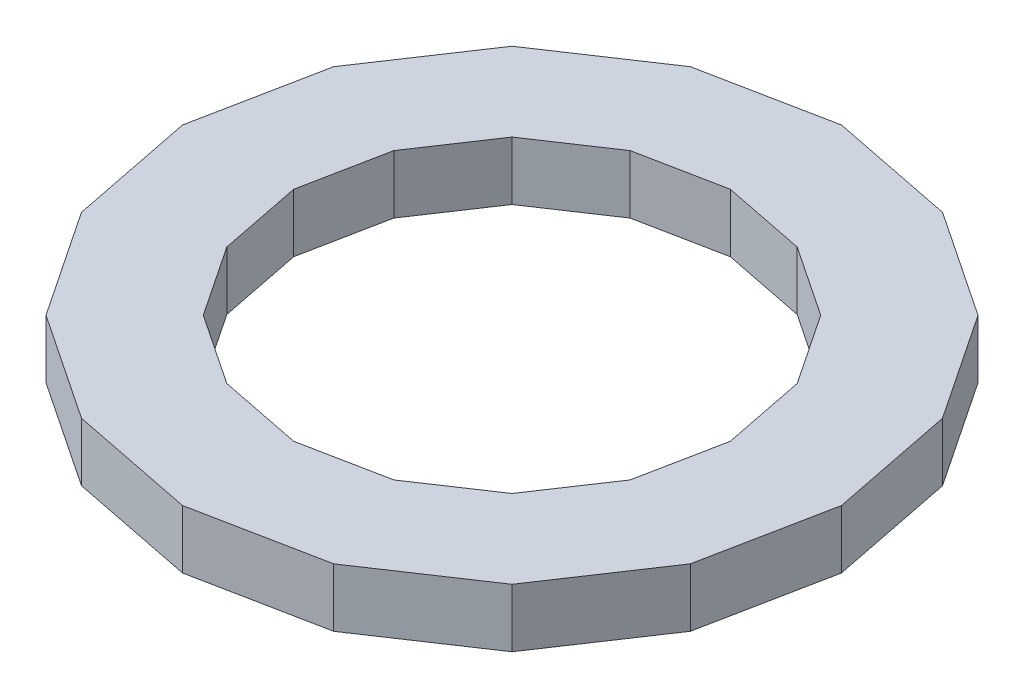
ISO-10303-21;
HEADER;
FILE_DESCRIPTION(('STEP AP214'),'2;1');
FILE_NAME('part.step','',(''),(''),'','','');
FILE_SCHEMA(('AUTOMOTIVE_DESIGN { 1 0 10303 214 1 1 1 1 }'));
ENDSEC;
DATA;
#1=APPLICATION_CONTEXT('core data for automotive mechanical design processes');
#2=APPLICATION_PROTOCOL_DEFINITION('international standard','automotive_design',2000,#1);
#3=PRODUCT_CONTEXT('',#1,'mechanical');
#4=PRODUCT('Part','Part','',(#3));
#5=PRODUCT_RELATED_PRODUCT_CATEGORY('part','',(#4));
#6=PRODUCT_DEFINITION_FORMATION('','',#4);
#7=PRODUCT_DEFINITION_CONTEXT('part definition',#1,'design');
#8=PRODUCT_DEFINITION('design','',#6,#7);
#9=PRODUCT_DEFINITION_SHAPE('','',#8);
#10=(LENGTH_UNIT() NAMED_UNIT(*) SI_UNIT(.MILLI.,.METRE.));
#11=(NAMED_UNIT(*) PLANE_ANGLE_UNIT() SI_UNIT($,.RADIAN.));
#12=(NAMED_UNIT(*) SI_UNIT($,.STERADIAN.) SOLID_ANGLE_UNIT());
#13=UNCERTAINTY_MEASURE_WITH_UNIT(LENGTH_MEASURE(1.E-05),#10,'distance_accuracy_value','');
#14=(GEOMETRIC_REPRESENTATION_CONTEXT(3) GLOBAL_UNCERTAINTY_ASSIGNED_CONTEXT((#13)) GLOBAL_UNIT_ASSIGNED_CONTEXT((#10,
#11,#12)) REPRESENTATION_CONTEXT('',''));
#15=CARTESIAN_POINT('',(0.,0.,0.));
#16=DIRECTION('',(0.,0.,1.));
#17=DIRECTION('',(1.,0.,0.));
#18=AXIS2_PLACEMENT_3D('',#15,#16,#17);
#19=CARTESIAN_POINT('',(0.,19.05,0.));
#20=DIRECTION('',(0.,1.,0.));
#21=DIRECTION('',(0.,0.,1.));
#22=AXIS2_PLACEMENT_3D('',#19,#20,#21);
#23=PLANE('',#22);
#24=DIRECTION('',(0.195090322016117,0.,-0.980785280403233));
#25=VECTOR('',#24,1.);
#26=CARTESIAN_POINT('',(99.2355510191511,19.05,41.1047111016983));
#27=LINE('',#26,#25);
#28=CARTESIAN_POINT('',(99.2355510191511,19.05,41.1047111016983));
#29=VERTEX_POINT('',#28);
#30=CARTESIAN_POINT('',(107.411786414847,19.05,-1.18654828935804E-12));
#31=VERTEX_POINT('',#30);
#32=EDGE_CURVE('E370',#29,#31,#27,.T.);
#33=ORIENTED_EDGE('',*,*,#32,.T.);
#34=DIRECTION('',(-0.195090322016139,0.,-0.980785280403228));
#35=VECTOR('',#34,1.);
#36=CARTESIAN_POINT('',(107.411786414847,19.05,-1.18654828935804E-12));
#37=LINE('',#36,#35);
#38=CARTESIAN_POINT('',(99.2355510191501,19.05,-41.1047111017005));
#39=VERTEX_POINT('',#38);
#40=EDGE_CURVE('E373',#31,#39,#37,.T.);
#41=ORIENTED_EDGE('',*,*,#40,.T.);
#42=DIRECTION('',(-0.555570233019612,0.,-0.831469612302539));
#43=VECTOR('',#42,1.);
#44=CARTESIAN_POINT('',(99.2355510191501,19.05,-41.1047111017005));
#45=LINE('',#44,#43);
#46=CARTESIAN_POINT('',(75.9516025532982,19.05,-75.9516025532999));
#47=VERTEX_POINT('',#46);
#48=EDGE_CURVE('E376',#39,#47,#45,.T.);
#49=ORIENTED_EDGE('',*,*,#48,.T.);
#50=DIRECTION('',(-0.831469612302551,0.,-0.555570233019593));
#51=VECTOR('',#50,1.);
#52=CARTESIAN_POINT('',(75.9516025532982,19.05,-75.9516025532999));
#53=LINE('',#52,#51);
#54=CARTESIAN_POINT('',(41.1047111016982,19.05,-99.2355510191511));
#55=VERTEX_POINT('',#54);
#56=EDGE_CURVE('E378',#47,#55,#53,.T.);
#57=ORIENTED_EDGE('',*,*,#56,.T.);
#58=DIRECTION('',(-0.980785280403233,0.,-0.195090322016117));
#59=VECTOR('',#58,1.);
#60=CARTESIAN_POINT('',(41.1047111016982,19.05,-99.2355510191511));
#61=LINE('',#60,#59);
#62=CARTESIAN_POINT('',(-1.20441912217675E-12,19.05,-107.411786414847));
#63=VERTEX_POINT('',#62);
#64=EDGE_CURVE('E380',#55,#63,#61,.T.);
#65=ORIENTED_EDGE('',*,*,#64,.T.);
#66=DIRECTION('',(-0.980785280403228,0.,0.195090322016139));
#67=VECTOR('',#66,1.);
#68=CARTESIAN_POINT('',(-1.20441912217675E-12,19.05,-107.411786414847));
#69=LINE('',#68,#67);
#70=CARTESIAN_POINT('',(-41.1047111017004,19.05,-99.2355510191502));
#71=VERTEX_POINT('',#70);
#72=EDGE_CURVE('E382',#63,#71,#69,.T.);
#73=ORIENTED_EDGE('',*,*,#72,.T.);
#74=DIRECTION('',(-0.831469612302539,0.,0.555570233019612));
#75=VECTOR('',#74,1.);
#76=CARTESIAN_POINT('',(-41.1047111017004,19.05,-99.2355510191502));
#77=LINE('',#76,#75);
#78=CARTESIAN_POINT('',(-75.9516025532999,19.05,-75.9516025532981));
#79=VERTEX_POINT('',#78);
#80=EDGE_CURVE('E384',#71,#79,#77,.T.);
#81=ORIENTED_EDGE('',*,*,#80,.T.);
#82=DIRECTION('',(-0.555570233019593,0.,0.831469612302552));
#83=VECTOR('',#82,1.);
#84=CARTESIAN_POINT('',(-75.9516025532999,19.05,-75.9516025532981));
#85=LINE('',#84,#83);
#86=CARTESIAN_POINT('',(-99.235551019151,19.05,-41.1047111016982));
#87=VERTEX_POINT('',#86);
#88=EDGE_CURVE('E386',#79,#87,#85,.T.);
#89=ORIENTED_EDGE('',*,*,#88,.T.);
#90=DIRECTION('',(-0.195090322016117,0.,0.980785280403233));
#91=VECTOR('',#90,1.);
#92=CARTESIAN_POINT('',(-99.235551019151,19.05,-41.1047111016982));
#93=LINE('',#92,#91);
#94=CARTESIAN_POINT('',(-107.411786414847,19.05,1.22649760240047E-12));
#95=VERTEX_POINT('',#94);
#96=EDGE_CURVE('E389',#87,#95,#93,.T.);
#97=ORIENTED_EDGE('',*,*,#96,.T.);
#98=DIRECTION('',(0.195090322016139,0.,0.980785280403228));
#99=VECTOR('',#98,1.);
#100=CARTESIAN_POINT('',(-107.411786414847,19.05,1.22649760240047E-12));
#101=LINE('',#100,#99);
#102=CARTESIAN_POINT('',(-99.2355510191501,19.05,41.1047111017005));
#103=VERTEX_POINT('',#102);
#104=EDGE_CURVE('E391',#95,#103,#101,.T.);
#105=ORIENTED_EDGE('',*,*,#104,.T.);
#106=DIRECTION('',(0.555570233019612,0.,0.831469612302539));
#107=VECTOR('',#106,1.);
#108=CARTESIAN_POINT('',(-99.2355510191501,19.05,41.1047111017005));
#109=LINE('',#108,#107);
#110=CARTESIAN_POINT('',(-75.9516025532982,19.05,75.9516025532999));
#111=VERTEX_POINT('',#110);
#112=EDGE_CURVE('E393',#103,#111,#109,.T.);
#113=ORIENTED_EDGE('',*,*,#112,.T.);
#114=DIRECTION('',(0.831469612302551,0.,0.555570233019593));
#115=VECTOR('',#114,1.);
#116=CARTESIAN_POINT('',(-75.9516025532982,19.05,75.9516025532999));
#117=LINE('',#116,#115);
#118=CARTESIAN_POINT('',(-41.1047111016983,19.05,99.235551019151));
#119=VERTEX_POINT('',#118);
#120=EDGE_CURVE('E396',#111,#119,#117,.T.);
#121=ORIENTED_EDGE('',*,*,#120,.T.);
#122=DIRECTION('',(0.980785280403233,0.,0.195090322016117));
#123=VECTOR('',#122,1.);
#124=CARTESIAN_POINT('',(-41.1047111016983,19.05,99.235551019151));
#125=LINE('',#124,#123);
#126=CARTESIAN_POINT('',(1.21963172159676E-12,19.05,107.411786414847));
#127=VERTEX_POINT('',#126);
#128=EDGE_CURVE('E399',#119,#127,#125,.T.);
#129=ORIENTED_EDGE('',*,*,#128,.T.);
#130=DIRECTION('',(0.980785280403228,0.,-0.195090322016139));
#131=VECTOR('',#130,1.);
#132=CARTESIAN_POINT('',(1.21963172159676E-12,19.05,107.411786414847));
#133=LINE('',#132,#131);
#134=CARTESIAN_POINT('',(41.1047111017005,19.05,99.2355510191502));
#135=VERTEX_POINT('',#134);
#136=EDGE_CURVE('E401',#127,#135,#133,.T.);
#137=ORIENTED_EDGE('',*,*,#136,.T.);
#138=DIRECTION('',(0.831469612302539,0.,-0.555570233019612));
#139=VECTOR('',#138,1.);
#140=CARTESIAN_POINT('',(41.1047111017005,19.05,99.2355510191502));
#141=LINE('',#140,#139);
#142=CARTESIAN_POINT('',(75.9516025532999,19.05,75.9516025532982));
#143=VERTEX_POINT('',#142);
#144=EDGE_CURVE('E404',#135,#143,#141,.T.);
#145=ORIENTED_EDGE('',*,*,#144,.T.);
#146=DIRECTION('',(0.555570233019593,0.,-0.831469612302552));
#147=VECTOR('',#146,1.);
#148=CARTESIAN_POINT('',(75.9516025532999,19.05,75.9516025532982));
#149=LINE('',#148,#147);
#150=EDGE_CURVE('E407',#143,#29,#149,.T.);
#151=ORIENTED_EDGE('',*,*,#150,.T.);
#152=EDGE_LOOP('',(#33,#41,#49,#57,#65,#73,#81,#89,#97,#105,#113,#121,#129,#137,#145,#151));
#153=FACE_BOUND('',#152,.T.);
#154=DIRECTION('',(-0.195090322016139,0.,-0.980785280403228));
#155=VECTOR('',#154,1.);
#156=CARTESIAN_POINT('',(71.1551248289587,19.05,-8.46654608505615E-13));
#157=LINE('',#156,#155);
#158=CARTESIAN_POINT('',(71.1551248289587,19.05,-8.46654608505615E-13));
#159=VERTEX_POINT('',#158);
#160=CARTESIAN_POINT('',(65.7387634627603,19.05,-27.2298873999131));
#161=VERTEX_POINT('',#160);
#162=EDGE_CURVE('E252',#159,#161,#157,.T.);
#163=ORIENTED_EDGE('',*,*,#162,.F.);
#164=DIRECTION('',(0.195090322016117,0.,-0.980785280403233));
#165=VECTOR('',#164,1.);
#166=CARTESIAN_POINT('',(65.7387634627609,19.05,27.2298873999116));
#167=LINE('',#166,#165);
#168=CARTESIAN_POINT('',(65.7387634627609,19.05,27.2298873999116));
#169=VERTEX_POINT('',#168);
#170=EDGE_CURVE('E243',#169,#159,#167,.T.);
#171=ORIENTED_EDGE('',*,*,#170,.F.);
#172=DIRECTION('',(0.555570233019593,0.,-0.831469612302552));
#173=VECTOR('',#172,1.);
#174=CARTESIAN_POINT('',(50.3142712827325,19.05,50.3142712827314));
#175=LINE('',#174,#173);
#176=CARTESIAN_POINT('',(50.3142712827325,19.05,50.3142712827314));
#177=VERTEX_POINT('',#176);
#178=EDGE_CURVE('E295',#177,#169,#175,.T.);
#179=ORIENTED_EDGE('',*,*,#178,.F.);
#180=DIRECTION('',(0.831469612302539,0.,-0.555570233019612));
#181=VECTOR('',#180,1.);
#182=CARTESIAN_POINT('',(27.2298873999131,19.05,65.7387634627603));
#183=LINE('',#182,#181);
#184=CARTESIAN_POINT('',(27.2298873999131,19.05,65.7387634627603));
#185=VERTEX_POINT('',#184);
#186=EDGE_CURVE('E293',#185,#177,#183,.T.);
#187=ORIENTED_EDGE('',*,*,#186,.F.);
#188=DIRECTION('',(0.980785280403228,0.,-0.19509032201614));
#189=VECTOR('',#188,1.);
#190=CARTESIAN_POINT('',(8.62105711361428E-13,19.05,71.1551248289587));
#191=LINE('',#190,#189);
#192=CARTESIAN_POINT('',(8.62105711361428E-13,19.05,71.1551248289587));
#193=VERTEX_POINT('',#192);
#194=EDGE_CURVE('E291',#193,#185,#191,.T.);
#195=ORIENTED_EDGE('',*,*,#194,.F.);
#196=DIRECTION('',(0.980785280403233,0.,0.195090322016117));
#197=VECTOR('',#196,1.);
#198=CARTESIAN_POINT('',(-27.2298873999116,19.05,65.7387634627609));
#199=LINE('',#198,#197);
#200=CARTESIAN_POINT('',(-27.2298873999116,19.05,65.7387634627609));
#201=VERTEX_POINT('',#200);
#202=EDGE_CURVE('E289',#201,#193,#199,.T.);
#203=ORIENTED_EDGE('',*,*,#202,.F.);
#204=DIRECTION('',(0.831469612302552,0.,0.555570233019593));
#205=VECTOR('',#204,1.);
#206=CARTESIAN_POINT('',(-50.3142712827314,19.05,50.3142712827326));
#207=LINE('',#206,#205);
#208=CARTESIAN_POINT('',(-50.3142712827314,19.05,50.3142712827326));
#209=VERTEX_POINT('',#208);
#210=EDGE_CURVE('E287',#209,#201,#207,.T.);
#211=ORIENTED_EDGE('',*,*,#210,.F.);
#212=DIRECTION('',(0.555570233019612,0.,0.831469612302539));
#213=VECTOR('',#212,1.);
#214=CARTESIAN_POINT('',(-65.7387634627603,19.05,27.2298873999131));
#215=LINE('',#214,#213);
#216=CARTESIAN_POINT('',(-65.7387634627603,19.05,27.2298873999131));
#217=VERTEX_POINT('',#216);
#218=EDGE_CURVE('E285',#217,#209,#215,.T.);
#219=ORIENTED_EDGE('',*,*,#218,.F.);
#220=DIRECTION('',(0.195090322016139,0.,0.980785280403228));
#221=VECTOR('',#220,1.);
#222=CARTESIAN_POINT('',(-71.1551248289587,19.05,8.25619489808786E-13));
#223=LINE('',#222,#221);
#224=CARTESIAN_POINT('',(-71.1551248289587,19.05,8.25619489808786E-13));
#225=VERTEX_POINT('',#224);
#226=EDGE_CURVE('E283',#225,#217,#223,.T.);
#227=ORIENTED_EDGE('',*,*,#226,.F.);
#228=DIRECTION('',(-0.195090322016117,0.,0.980785280403233));
#229=VECTOR('',#228,1.);
#230=CARTESIAN_POINT('',(-65.7387634627609,19.05,-27.2298873999116));
#231=LINE('',#230,#229);
#232=CARTESIAN_POINT('',(-65.7387634627609,19.05,-27.2298873999116));
#233=VERTEX_POINT('',#232);
#234=EDGE_CURVE('E280',#233,#225,#231,.T.);
#235=ORIENTED_EDGE('',*,*,#234,.F.);
#236=DIRECTION('',(-0.555570233019593,0.,0.831469612302551));
#237=VECTOR('',#236,1.);
#238=CARTESIAN_POINT('',(-50.3142712827325,19.05,-50.3142712827314));
#239=LINE('',#238,#237);
#240=CARTESIAN_POINT('',(-50.3142712827325,19.05,-50.3142712827314));
#241=VERTEX_POINT('',#240);
#242=EDGE_CURVE('E277',#241,#233,#239,.T.);
#243=ORIENTED_EDGE('',*,*,#242,.F.);
#244=DIRECTION('',(-0.831469612302539,0.,0.555570233019612));
#245=VECTOR('',#244,1.);
#246=CARTESIAN_POINT('',(-27.2298873999131,19.05,-65.7387634627603));
#247=LINE('',#246,#245);
#248=CARTESIAN_POINT('',(-27.2298873999131,19.05,-65.7387634627603));
#249=VERTEX_POINT('',#248);
#250=EDGE_CURVE('E275',#249,#241,#247,.T.);
#251=ORIENTED_EDGE('',*,*,#250,.F.);
#252=DIRECTION('',(-0.980785280403228,0.,0.19509032201614));
#253=VECTOR('',#252,1.);
#254=CARTESIAN_POINT('',(-8.39524885614129E-13,19.05,-71.1551248289587));
#255=LINE('',#254,#253);
#256=CARTESIAN_POINT('',(-8.39524885614129E-13,19.05,-71.1551248289587));
#257=VERTEX_POINT('',#256);
#258=EDGE_CURVE('E273',#257,#249,#255,.T.);
#259=ORIENTED_EDGE('',*,*,#258,.F.);
#260=DIRECTION('',(-0.980785280403233,0.,-0.195090322016117));
#261=VECTOR('',#260,1.);
#262=CARTESIAN_POINT('',(27.2298873999116,19.05,-65.7387634627609));
#263=LINE('',#262,#261);
#264=CARTESIAN_POINT('',(27.2298873999116,19.05,-65.7387634627609));
#265=VERTEX_POINT('',#264);
#266=EDGE_CURVE('E271',#265,#257,#263,.T.);
#267=ORIENTED_EDGE('',*,*,#266,.F.);
#268=DIRECTION('',(-0.831469612302551,0.,-0.555570233019593));
#269=VECTOR('',#268,1.);
#270=CARTESIAN_POINT('',(50.3142712827314,19.05,-50.3142712827326));
#271=LINE('',#270,#269);
#272=CARTESIAN_POINT('',(50.3142712827314,19.05,-50.3142712827326));
#273=VERTEX_POINT('',#272);
#274=EDGE_CURVE('E267',#273,#265,#271,.T.);
#275=ORIENTED_EDGE('',*,*,#274,.F.);
#276=DIRECTION('',(-0.555570233019612,0.,-0.831469612302539));
#277=VECTOR('',#276,1.);
#278=CARTESIAN_POINT('',(65.7387634627603,19.05,-27.2298873999131));
#279=LINE('',#278,#277);
#280=EDGE_CURVE('E265',#161,#273,#279,.T.);
#281=ORIENTED_EDGE('',*,*,#280,.F.);
#282=EDGE_LOOP('',(#163,#171,#179,#187,#195,#203,#211,#219,#227,#235,#243,#251,#259,#267,#275,#281));
#283=FACE_BOUND('',#282,.T.);
#284=ADVANCED_FACE('F34',(#153,#283),#23,.T.);
#285=CARTESIAN_POINT('',(0.,0.,0.));
#286=DIRECTION('',(0.,1.,0.));
#287=DIRECTION('',(0.,0.,1.));
#288=AXIS2_PLACEMENT_3D('',#285,#286,#287);
#289=PLANE('',#288);
#290=DIRECTION('',(0.195090322016117,0.,-0.980785280403233));
#291=VECTOR('',#290,1.);
#292=CARTESIAN_POINT('',(99.2355510191511,0.,41.1047111016983));
#293=LINE('',#292,#291);
#294=CARTESIAN_POINT('',(99.2355510191511,0.,41.1047111016983));
#295=VERTEX_POINT('',#294);
#296=CARTESIAN_POINT('',(107.411786414847,0.,-1.18654828935804E-12));
#297=VERTEX_POINT('',#296);
#298=EDGE_CURVE('E260',#295,#297,#293,.T.);
#299=ORIENTED_EDGE('',*,*,#298,.F.);
#300=DIRECTION('',(0.555570233019593,0.,-0.831469612302552));
#301=VECTOR('',#300,1.);
#302=CARTESIAN_POINT('',(75.9516025532999,0.,75.9516025532982));
#303=LINE('',#302,#301);
#304=CARTESIAN_POINT('',(75.9516025532999,0.,75.9516025532982));
#305=VERTEX_POINT('',#304);
#306=EDGE_CURVE('E374',#305,#295,#303,.T.);
#307=ORIENTED_EDGE('',*,*,#306,.F.);
#308=DIRECTION('',(0.831469612302539,0.,-0.555570233019612));
#309=VECTOR('',#308,1.);
#310=CARTESIAN_POINT('',(41.1047111017005,0.,99.2355510191502));
#311=LINE('',#310,#309);
#312=CARTESIAN_POINT('',(41.1047111017005,0.,99.2355510191502));
#313=VERTEX_POINT('',#312);
#314=EDGE_CURVE('E442',#313,#305,#311,.T.);
#315=ORIENTED_EDGE('',*,*,#314,.F.);
#316=DIRECTION('',(0.980785280403228,0.,-0.195090322016139));
#317=VECTOR('',#316,1.);
#318=CARTESIAN_POINT('',(1.21963172159676E-12,0.,107.411786414847));
#319=LINE('',#318,#317);
#320=CARTESIAN_POINT('',(1.21963172159676E-12,0.,107.411786414847));
#321=VERTEX_POINT('',#320);
#322=EDGE_CURVE('E439',#321,#313,#319,.T.);
#323=ORIENTED_EDGE('',*,*,#322,.F.);
#324=DIRECTION('',(0.980785280403233,0.,0.195090322016117));
#325=VECTOR('',#324,1.);
#326=CARTESIAN_POINT('',(-41.1047111016983,0.,99.235551019151));
#327=LINE('',#326,#325);
#328=CARTESIAN_POINT('',(-41.1047111016983,0.,99.235551019151));
#329=VERTEX_POINT('',#328);
#330=EDGE_CURVE('E436',#329,#321,#327,.T.);
#331=ORIENTED_EDGE('',*,*,#330,.F.);
#332=DIRECTION('',(0.831469612302551,0.,0.555570233019593));
#333=VECTOR('',#332,1.);
#334=CARTESIAN_POINT('',(-75.9516025532982,0.,75.9516025532999));
#335=LINE('',#334,#333);
#336=CARTESIAN_POINT('',(-75.9516025532982,0.,75.9516025532999));
#337=VERTEX_POINT('',#336);
#338=EDGE_CURVE('E433',#337,#329,#335,.T.);
#339=ORIENTED_EDGE('',*,*,#338,.F.);
#340=DIRECTION('',(0.555570233019612,0.,0.831469612302539));
#341=VECTOR('',#340,1.);
#342=CARTESIAN_POINT('',(-99.2355510191501,0.,41.1047111017005));
#343=LINE('',#342,#341);
#344=CARTESIAN_POINT('',(-99.2355510191501,0.,41.1047111017005));
#345=VERTEX_POINT('',#344);
#346=EDGE_CURVE('E431',#345,#337,#343,.T.);
#347=ORIENTED_EDGE('',*,*,#346,.F.);
#348=DIRECTION('',(0.195090322016139,0.,0.980785280403228));
#349=VECTOR('',#348,1.);
#350=CARTESIAN_POINT('',(-107.411786414847,0.,1.22649760240047E-12));
#351=LINE('',#350,#349);
#352=CARTESIAN_POINT('',(-107.411786414847,0.,1.22649760240047E-12));
#353=VERTEX_POINT('',#352);
#354=EDGE_CURVE('E428',#353,#345,#351,.T.);
#355=ORIENTED_EDGE('',*,*,#354,.F.);
#356=DIRECTION('',(-0.195090322016117,0.,0.980785280403233));
#357=VECTOR('',#356,1.);
#358=CARTESIAN_POINT('',(-99.235551019151,0.,-41.1047111016982));
#359=LINE('',#358,#357);
#360=CARTESIAN_POINT('',(-99.235551019151,0.,-41.1047111016982));
#361=VERTEX_POINT('',#360);
#362=EDGE_CURVE('E426',#361,#353,#359,.T.);
#363=ORIENTED_EDGE('',*,*,#362,.F.);
#364=DIRECTION('',(-0.555570233019593,0.,0.831469612302552));
#365=VECTOR('',#364,1.);
#366=CARTESIAN_POINT('',(-75.9516025532999,0.,-75.9516025532981));
#367=LINE('',#366,#365);
#368=CARTESIAN_POINT('',(-75.9516025532999,0.,-75.9516025532981));
#369=VERTEX_POINT('',#368);
#370=EDGE_CURVE('E424',#369,#361,#367,.T.);
#371=ORIENTED_EDGE('',*,*,#370,.F.);
#372=DIRECTION('',(-0.831469612302539,0.,0.555570233019612));
#373=VECTOR('',#372,1.);
#374=CARTESIAN_POINT('',(-41.1047111017004,0.,-99.2355510191502));
#375=LINE('',#374,#373);
#376=CARTESIAN_POINT('',(-41.1047111017004,0.,-99.2355510191502));
#377=VERTEX_POINT('',#376);
#378=EDGE_CURVE('E422',#377,#369,#375,.T.);
#379=ORIENTED_EDGE('',*,*,#378,.F.);
#380=DIRECTION('',(-0.980785280403228,0.,0.195090322016139));
#381=VECTOR('',#380,1.);
#382=CARTESIAN_POINT('',(-1.20441912217675E-12,0.,-107.411786414847));
#383=LINE('',#382,#381);
#384=CARTESIAN_POINT('',(-1.20441912217675E-12,0.,-107.411786414847));
#385=VERTEX_POINT('',#384);
#386=EDGE_CURVE('E420',#385,#377,#383,.T.);
#387=ORIENTED_EDGE('',*,*,#386,.F.);
#388=DIRECTION('',(-0.980785280403233,0.,-0.195090322016117));
#389=VECTOR('',#388,1.);
#390=CARTESIAN_POINT('',(41.1047111016982,0.,-99.2355510191511));
#391=LINE('',#390,#389);
#392=CARTESIAN_POINT('',(41.1047111016982,0.,-99.2355510191511));
#393=VERTEX_POINT('',#392);
#394=EDGE_CURVE('E418',#393,#385,#391,.T.);
#395=ORIENTED_EDGE('',*,*,#394,.F.);
#396=DIRECTION('',(-0.831469612302551,0.,-0.555570233019593));
#397=VECTOR('',#396,1.);
#398=CARTESIAN_POINT('',(75.9516025532982,0.,-75.9516025532999));
#399=LINE('',#398,#397);
#400=CARTESIAN_POINT('',(75.9516025532982,0.,-75.9516025532999));
#401=VERTEX_POINT('',#400);
#402=EDGE_CURVE('E416',#401,#393,#399,.T.);
#403=ORIENTED_EDGE('',*,*,#402,.F.);
#404=DIRECTION('',(-0.555570233019612,0.,-0.831469612302539));
#405=VECTOR('',#404,1.);
#406=CARTESIAN_POINT('',(99.2355510191501,0.,-41.1047111017005));
#407=LINE('',#406,#405);
#408=CARTESIAN_POINT('',(99.2355510191501,0.,-41.1047111017005));
#409=VERTEX_POINT('',#408);
#410=EDGE_CURVE('E414',#409,#401,#407,.T.);
#411=ORIENTED_EDGE('',*,*,#410,.F.);
#412=DIRECTION('',(-0.195090322016139,0.,-0.980785280403228));
#413=VECTOR('',#412,1.);
#414=CARTESIAN_POINT('',(107.411786414847,0.,-1.18654828935804E-12));
#415=LINE('',#414,#413);
#416=EDGE_CURVE('E412',#297,#409,#415,.T.);
#417=ORIENTED_EDGE('',*,*,#416,.F.);
#418=EDGE_LOOP('',(#299,#307,#315,#323,#331,#339,#347,#355,#363,#371,#379,#387,#395,#403,#411,#417));
#419=FACE_BOUND('',#418,.T.);
#420=DIRECTION('',(0.195090322016117,0.,-0.980785280403233));
#421=VECTOR('',#420,1.);
#422=CARTESIAN_POINT('',(65.7387634627609,0.,27.2298873999116));
#423=LINE('',#422,#421);
#424=CARTESIAN_POINT('',(65.7387634627609,0.,27.2298873999116));
#425=VERTEX_POINT('',#424);
#426=CARTESIAN_POINT('',(71.1551248289587,0.,-8.46654608505615E-13));
#427=VERTEX_POINT('',#426);
#428=EDGE_CURVE('E57',#425,#427,#423,.T.);
#429=ORIENTED_EDGE('',*,*,#428,.T.);
#430=DIRECTION('',(-0.195090322016139,0.,-0.980785280403228));
#431=VECTOR('',#430,1.);
#432=CARTESIAN_POINT('',(71.1551248289587,0.,-8.46654608505615E-13));
#433=LINE('',#432,#431);
#434=CARTESIAN_POINT('',(65.7387634627603,0.,-27.2298873999131));
#435=VERTEX_POINT('',#434);
#436=EDGE_CURVE('E259',#427,#435,#433,.T.);
#437=ORIENTED_EDGE('',*,*,#436,.T.);
#438=DIRECTION('',(-0.555570233019612,0.,-0.831469612302539));
#439=VECTOR('',#438,1.);
#440=CARTESIAN_POINT('',(65.7387634627603,0.,-27.2298873999131));
#441=LINE('',#440,#439);
#442=CARTESIAN_POINT('',(50.3142712827314,0.,-50.3142712827326));
#443=VERTEX_POINT('',#442);
#444=EDGE_CURVE('E299',#435,#443,#441,.T.);
#445=ORIENTED_EDGE('',*,*,#444,.T.);
#446=DIRECTION('',(-0.831469612302551,0.,-0.555570233019593));
#447=VECTOR('',#446,1.);
#448=CARTESIAN_POINT('',(50.3142712827314,0.,-50.3142712827326));
#449=LINE('',#448,#447);
#450=CARTESIAN_POINT('',(27.2298873999116,0.,-65.7387634627609));
#451=VERTEX_POINT('',#450);
#452=EDGE_CURVE('E302',#443,#451,#449,.T.);
#453=ORIENTED_EDGE('',*,*,#452,.T.);
#454=DIRECTION('',(-0.980785280403233,0.,-0.195090322016117));
#455=VECTOR('',#454,1.);
#456=CARTESIAN_POINT('',(27.2298873999116,0.,-65.7387634627609));
#457=LINE('',#456,#455);
#458=CARTESIAN_POINT('',(-8.39524885614129E-13,0.,-71.1551248289587));
#459=VERTEX_POINT('',#458);
#460=EDGE_CURVE('E305',#451,#459,#457,.T.);
#461=ORIENTED_EDGE('',*,*,#460,.T.);
#462=DIRECTION('',(-0.980785280403228,0.,0.19509032201614));
#463=VECTOR('',#462,1.);
#464=CARTESIAN_POINT('',(-8.39524885614129E-13,0.,-71.1551248289587));
#465=LINE('',#464,#463);
#466=CARTESIAN_POINT('',(-27.2298873999131,0.,-65.7387634627603));
#467=VERTEX_POINT('',#466);
#468=EDGE_CURVE('E308',#459,#467,#465,.T.);
#469=ORIENTED_EDGE('',*,*,#468,.T.);
#470=DIRECTION('',(-0.831469612302539,0.,0.555570233019612));
#471=VECTOR('',#470,1.);
#472=CARTESIAN_POINT('',(-27.2298873999131,0.,-65.7387634627603));
#473=LINE('',#472,#471);
#474=CARTESIAN_POINT('',(-50.3142712827325,0.,-50.3142712827314));
#475=VERTEX_POINT('',#474);
#476=EDGE_CURVE('E311',#467,#475,#473,.T.);
#477=ORIENTED_EDGE('',*,*,#476,.T.);
#478=DIRECTION('',(-0.555570233019593,0.,0.831469612302551));
#479=VECTOR('',#478,1.);
#480=CARTESIAN_POINT('',(-50.3142712827325,0.,-50.3142712827314));
#481=LINE('',#480,#479);
#482=CARTESIAN_POINT('',(-65.7387634627609,0.,-27.2298873999116));
#483=VERTEX_POINT('',#482);
#484=EDGE_CURVE('E314',#475,#483,#481,.T.);
#485=ORIENTED_EDGE('',*,*,#484,.T.);
#486=DIRECTION('',(-0.195090322016117,0.,0.980785280403233));
#487=VECTOR('',#486,1.);
#488=CARTESIAN_POINT('',(-65.7387634627609,0.,-27.2298873999116));
#489=LINE('',#488,#487);
#490=CARTESIAN_POINT('',(-71.1551248289587,0.,8.25619489808786E-13));
#491=VERTEX_POINT('',#490);
#492=EDGE_CURVE('E317',#483,#491,#489,.T.);
#493=ORIENTED_EDGE('',*,*,#492,.T.);
#494=DIRECTION('',(0.195090322016139,0.,0.980785280403228));
#495=VECTOR('',#494,1.);
#496=CARTESIAN_POINT('',(-71.1551248289587,0.,8.25619489808786E-13));
#497=LINE('',#496,#495);
#498=CARTESIAN_POINT('',(-65.7387634627603,0.,27.2298873999131));
#499=VERTEX_POINT('',#498);
#500=EDGE_CURVE('E321',#491,#499,#497,.T.);
#501=ORIENTED_EDGE('',*,*,#500,.T.);
#502=DIRECTION('',(0.555570233019612,0.,0.831469612302539));
#503=VECTOR('',#502,1.);
#504=CARTESIAN_POINT('',(-65.7387634627603,0.,27.2298873999131));
#505=LINE('',#504,#503);
#506=CARTESIAN_POINT('',(-50.3142712827314,0.,50.3142712827326));
#507=VERTEX_POINT('',#506);
#508=EDGE_CURVE('E324',#499,#507,#505,.T.);
#509=ORIENTED_EDGE('',*,*,#508,.T.);
#510=DIRECTION('',(0.831469612302552,0.,0.555570233019593));
#511=VECTOR('',#510,1.);
#512=CARTESIAN_POINT('',(-50.3142712827314,0.,50.3142712827326));
#513=LINE('',#512,#511);
#514=CARTESIAN_POINT('',(-27.2298873999116,0.,65.7387634627609));
#515=VERTEX_POINT('',#514);
#516=EDGE_CURVE('E327',#507,#515,#513,.T.);
#517=ORIENTED_EDGE('',*,*,#516,.T.);
#518=DIRECTION('',(0.980785280403233,0.,0.195090322016117));
#519=VECTOR('',#518,1.);
#520=CARTESIAN_POINT('',(-27.2298873999116,0.,65.7387634627609));
#521=LINE('',#520,#519);
#522=CARTESIAN_POINT('',(8.62105711361428E-13,0.,71.1551248289587));
#523=VERTEX_POINT('',#522);
#524=EDGE_CURVE('E330',#515,#523,#521,.T.);
#525=ORIENTED_EDGE('',*,*,#524,.T.);
#526=DIRECTION('',(0.980785280403228,0.,-0.19509032201614));
#527=VECTOR('',#526,1.);
#528=CARTESIAN_POINT('',(8.62105711361428E-13,0.,71.1551248289587));
#529=LINE('',#528,#527);
#530=CARTESIAN_POINT('',(27.2298873999131,0.,65.7387634627603));
#531=VERTEX_POINT('',#530);
#532=EDGE_CURVE('E333',#523,#531,#529,.T.);
#533=ORIENTED_EDGE('',*,*,#532,.T.);
#534=DIRECTION('',(0.831469612302539,0.,-0.555570233019612));
#535=VECTOR('',#534,1.);
#536=CARTESIAN_POINT('',(27.2298873999131,0.,65.7387634627603));
#537=LINE('',#536,#535);
#538=CARTESIAN_POINT('',(50.3142712827325,0.,50.3142712827314));
#539=VERTEX_POINT('',#538);
#540=EDGE_CURVE('E336',#531,#539,#537,.T.);
#541=ORIENTED_EDGE('',*,*,#540,.T.);
#542=DIRECTION('',(0.555570233019593,0.,-0.831469612302552));
#543=VECTOR('',#542,1.);
#544=CARTESIAN_POINT('',(50.3142712827325,0.,50.3142712827314));
#545=LINE('',#544,#543);
#546=EDGE_CURVE('E253',#539,#425,#545,.T.);
#547=ORIENTED_EDGE('',*,*,#546,.T.);
#548=EDGE_LOOP('',(#429,#437,#445,#453,#461,#469,#477,#485,#493,#501,#509,#517,#525,#533,#541,#547));
#549=FACE_BOUND('',#548,.T.);
#550=ADVANCED_FACE('F500',(#419,#549),#289,.F.);
#551=CARTESIAN_POINT('',(99.2355510191511,19.05,41.1047111016983));
#552=DIRECTION('',(-0.980785280403233,0.,-0.195090322016117));
#553=DIRECTION('',(-0.195090322016117,0.,0.980785280403233));
#554=AXIS2_PLACEMENT_3D('',#551,#552,#553);
#555=PLANE('',#554);
#556=ORIENTED_EDGE('',*,*,#298,.T.);
#557=DIRECTION('',(0.,-1.,0.));
#558=VECTOR('',#557,1.);
#559=CARTESIAN_POINT('',(107.411786414847,19.05,-1.18654828935804E-12));
#560=LINE('',#559,#558);
#561=EDGE_CURVE('E11',#31,#297,#560,.T.);
#562=ORIENTED_EDGE('',*,*,#561,.F.);
#563=ORIENTED_EDGE('',*,*,#32,.F.);
#564=DIRECTION('',(0.,-1.,0.));
#565=VECTOR('',#564,1.);
#566=CARTESIAN_POINT('',(99.2355510191511,19.05,41.1047111016983));
#567=LINE('',#566,#565);
#568=EDGE_CURVE('E409',#29,#295,#567,.T.);
#569=ORIENTED_EDGE('',*,*,#568,.T.);
#570=EDGE_LOOP('',(#556,#562,#563,#569));
#571=FACE_BOUND('',#570,.T.);
#572=ADVANCED_FACE('F36',(#571),#555,.F.);
#573=CARTESIAN_POINT('',(107.411786414847,19.05,-1.18654828935804E-12));
#574=DIRECTION('',(-0.980785280403228,0.,0.195090322016139));
#575=DIRECTION('',(0.195090322016139,0.,0.980785280403228));
#576=AXIS2_PLACEMENT_3D('',#573,#574,#575);
#577=PLANE('',#576);
#578=ORIENTED_EDGE('',*,*,#416,.T.);
#579=DIRECTION('',(0.,-1.,0.));
#580=VECTOR('',#579,1.);
#581=CARTESIAN_POINT('',(99.2355510191501,19.05,-41.1047111017005));
#582=LINE('',#581,#580);
#583=EDGE_CURVE('E42',#39,#409,#582,.T.);
#584=ORIENTED_EDGE('',*,*,#583,.F.);
#585=ORIENTED_EDGE('',*,*,#40,.F.);
#586=ORIENTED_EDGE('',*,*,#561,.T.);
#587=EDGE_LOOP('',(#578,#584,#585,#586));
#588=FACE_BOUND('',#587,.T.);
#589=ADVANCED_FACE('F517',(#588),#577,.F.);
#590=CARTESIAN_POINT('',(99.2355510191501,19.05,-41.1047111017005));
#591=DIRECTION('',(-0.831469612302539,0.,0.555570233019612));
#592=DIRECTION('',(0.555570233019612,0.,0.831469612302539));
#593=AXIS2_PLACEMENT_3D('',#590,#591,#592);
#594=PLANE('',#593);
#595=ORIENTED_EDGE('',*,*,#410,.T.);
#596=DIRECTION('',(0.,-1.,0.));
#597=VECTOR('',#596,1.);
#598=CARTESIAN_POINT('',(75.9516025532982,19.05,-75.9516025532999));
#599=LINE('',#598,#597);
#600=EDGE_CURVE('E487',#47,#401,#599,.T.);
#601=ORIENTED_EDGE('',*,*,#600,.F.);
#602=ORIENTED_EDGE('',*,*,#48,.F.);
#603=ORIENTED_EDGE('',*,*,#583,.T.);
#604=EDGE_LOOP('',(#595,#601,#602,#603));
#605=FACE_BOUND('',#604,.T.);
#606=ADVANCED_FACE('F494',(#605),#594,.F.);
#607=CARTESIAN_POINT('',(75.9516025532982,19.05,-75.9516025532999));
#608=DIRECTION('',(-0.555570233019593,0.,0.831469612302551));
#609=DIRECTION('',(0.831469612302551,0.,0.555570233019593));
#610=AXIS2_PLACEMENT_3D('',#607,#608,#609);
#611=PLANE('',#610);
#612=ORIENTED_EDGE('',*,*,#402,.T.);
#613=DIRECTION('',(0.,-1.,0.));
#614=VECTOR('',#613,1.);
#615=CARTESIAN_POINT('',(41.1047111016982,19.05,-99.2355510191511));
#616=LINE('',#615,#614);
#617=EDGE_CURVE('E483',#55,#393,#616,.T.);
#618=ORIENTED_EDGE('',*,*,#617,.F.);
#619=ORIENTED_EDGE('',*,*,#56,.F.);
#620=ORIENTED_EDGE('',*,*,#600,.T.);
#621=EDGE_LOOP('',(#612,#618,#619,#620));
#622=FACE_BOUND('',#621,.T.);
#623=ADVANCED_FACE('F506',(#622),#611,.F.);
#624=CARTESIAN_POINT('',(41.1047111016982,19.05,-99.2355510191511));
#625=DIRECTION('',(-0.195090322016117,0.,0.980785280403233));
#626=DIRECTION('',(0.980785280403233,0.,0.195090322016117));
#627=AXIS2_PLACEMENT_3D('',#624,#625,#626);
#628=PLANE('',#627);
#629=ORIENTED_EDGE('',*,*,#394,.T.);
#630=DIRECTION('',(0.,-1.,0.));
#631=VECTOR('',#630,1.);
#632=CARTESIAN_POINT('',(-1.20441912217675E-12,19.05,-107.411786414847));
#633=LINE('',#632,#631);
#634=EDGE_CURVE('E480',#63,#385,#633,.T.);
#635=ORIENTED_EDGE('',*,*,#634,.F.);
#636=ORIENTED_EDGE('',*,*,#64,.F.);
#637=ORIENTED_EDGE('',*,*,#617,.T.);
#638=EDGE_LOOP('',(#629,#635,#636,#637));
#639=FACE_BOUND('',#638,.T.);
#640=ADVANCED_FACE('F510',(#639),#628,.F.);
#641=CARTESIAN_POINT('',(-1.20441912217675E-12,19.05,-107.411786414847));
#642=DIRECTION('',(0.195090322016139,0.,0.980785280403228));
#643=DIRECTION('',(0.980785280403228,0.,-0.195090322016139));
#644=AXIS2_PLACEMENT_3D('',#641,#642,#643);
#645=PLANE('',#644);
#646=ORIENTED_EDGE('',*,*,#386,.T.);
#647=DIRECTION('',(0.,-1.,0.));
#648=VECTOR('',#647,1.);
#649=CARTESIAN_POINT('',(-41.1047111017004,19.05,-99.2355510191502));
#650=LINE('',#649,#648);
#651=EDGE_CURVE('E476',#71,#377,#650,.T.);
#652=ORIENTED_EDGE('',*,*,#651,.F.);
#653=ORIENTED_EDGE('',*,*,#72,.F.);
#654=ORIENTED_EDGE('',*,*,#634,.T.);
#655=EDGE_LOOP('',(#646,#652,#653,#654));
#656=FACE_BOUND('',#655,.T.);
#657=ADVANCED_FACE('F570',(#656),#645,.F.);
#658=CARTESIAN_POINT('',(-41.1047111017004,19.05,-99.2355510191502));
#659=DIRECTION('',(0.555570233019612,0.,0.831469612302539));
#660=DIRECTION('',(0.831469612302539,0.,-0.555570233019612));
#661=AXIS2_PLACEMENT_3D('',#658,#659,#660);
#662=PLANE('',#661);
#663=ORIENTED_EDGE('',*,*,#378,.T.);
#664=DIRECTION('',(0.,-1.,0.));
#665=VECTOR('',#664,1.);
#666=CARTESIAN_POINT('',(-75.9516025532999,19.05,-75.9516025532981));
#667=LINE('',#666,#665);
#668=EDGE_CURVE('E473',#79,#369,#667,.T.);
#669=ORIENTED_EDGE('',*,*,#668,.F.);
#670=ORIENTED_EDGE('',*,*,#80,.F.);
#671=ORIENTED_EDGE('',*,*,#651,.T.);
#672=EDGE_LOOP('',(#663,#669,#670,#671));
#673=FACE_BOUND('',#672,.T.);
#674=ADVANCED_FACE('F567',(#673),#662,.F.);
#675=CARTESIAN_POINT('',(-75.9516025532999,19.05,-75.9516025532981));
#676=DIRECTION('',(0.831469612302552,0.,0.555570233019593));
#677=DIRECTION('',(0.555570233019593,0.,-0.831469612302552));
#678=AXIS2_PLACEMENT_3D('',#675,#676,#677);
#679=PLANE('',#678);
#680=ORIENTED_EDGE('',*,*,#370,.T.);
#681=DIRECTION('',(0.,-1.,0.));
#682=VECTOR('',#681,1.);
#683=CARTESIAN_POINT('',(-99.235551019151,19.05,-41.1047111016982));
#684=LINE('',#683,#682);
#685=EDGE_CURVE('E470',#87,#361,#684,.T.);
#686=ORIENTED_EDGE('',*,*,#685,.F.);
#687=ORIENTED_EDGE('',*,*,#88,.F.);
#688=ORIENTED_EDGE('',*,*,#668,.T.);
#689=EDGE_LOOP('',(#680,#686,#687,#688));
#690=FACE_BOUND('',#689,.T.);
#691=ADVANCED_FACE('F563',(#690),#679,.F.);
#692=CARTESIAN_POINT('',(-99.235551019151,19.05,-41.1047111016982));
#693=DIRECTION('',(0.980785280403233,0.,0.195090322016117));
#694=DIRECTION('',(0.195090322016117,0.,-0.980785280403233));
#695=AXIS2_PLACEMENT_3D('',#692,#693,#694);
#696=PLANE('',#695);
#697=ORIENTED_EDGE('',*,*,#362,.T.);
#698=DIRECTION('',(0.,-1.,0.));
#699=VECTOR('',#698,1.);
#700=CARTESIAN_POINT('',(-107.411786414847,19.05,1.22649760240047E-12));
#701=LINE('',#700,#699);
#702=EDGE_CURVE('E467',#95,#353,#701,.T.);
#703=ORIENTED_EDGE('',*,*,#702,.F.);
#704=ORIENTED_EDGE('',*,*,#96,.F.);
#705=ORIENTED_EDGE('',*,*,#685,.T.);
#706=EDGE_LOOP('',(#697,#703,#704,#705));
#707=FACE_BOUND('',#706,.T.);
#708=ADVANCED_FACE('F559',(#707),#696,.F.);
#709=CARTESIAN_POINT('',(-107.411786414847,19.05,1.22649760240047E-12));
#710=DIRECTION('',(0.980785280403228,0.,-0.195090322016139));
#711=DIRECTION('',(-0.195090322016139,0.,-0.980785280403228));
#712=AXIS2_PLACEMENT_3D('',#709,#710,#711);
#713=PLANE('',#712);
#714=ORIENTED_EDGE('',*,*,#354,.T.);
#715=DIRECTION('',(0.,-1.,0.));
#716=VECTOR('',#715,1.);
#717=CARTESIAN_POINT('',(-99.2355510191501,19.05,41.1047111017005));
#718=LINE('',#717,#716);
#719=EDGE_CURVE('E463',#103,#345,#718,.T.);
#720=ORIENTED_EDGE('',*,*,#719,.F.);
#721=ORIENTED_EDGE('',*,*,#104,.F.);
#722=ORIENTED_EDGE('',*,*,#702,.T.);
#723=EDGE_LOOP('',(#714,#720,#721,#722));
#724=FACE_BOUND('',#723,.T.);
#725=ADVANCED_FACE('F554',(#724),#713,.F.);
#726=CARTESIAN_POINT('',(-99.2355510191501,19.05,41.1047111017005));
#727=DIRECTION('',(0.831469612302539,0.,-0.555570233019612));
#728=DIRECTION('',(-0.555570233019612,0.,-0.831469612302539));
#729=AXIS2_PLACEMENT_3D('',#726,#727,#728);
#730=PLANE('',#729);
#731=ORIENTED_EDGE('',*,*,#346,.T.);
#732=DIRECTION('',(0.,-1.,0.));
#733=VECTOR('',#732,1.);
#734=CARTESIAN_POINT('',(-75.9516025532982,19.05,75.9516025532999));
#735=LINE('',#734,#733);
#736=EDGE_CURVE('E460',#111,#337,#735,.T.);
#737=ORIENTED_EDGE('',*,*,#736,.F.);
#738=ORIENTED_EDGE('',*,*,#112,.F.);
#739=ORIENTED_EDGE('',*,*,#719,.T.);
#740=EDGE_LOOP('',(#731,#737,#738,#739));
#741=FACE_BOUND('',#740,.T.);
#742=ADVANCED_FACE('F548',(#741),#730,.F.);
#743=CARTESIAN_POINT('',(-75.9516025532982,19.05,75.9516025532999));
#744=DIRECTION('',(0.555570233019593,0.,-0.831469612302551));
#745=DIRECTION('',(-0.831469612302552,0.,-0.555570233019593));
#746=AXIS2_PLACEMENT_3D('',#743,#744,#745);
#747=PLANE('',#746);
#748=ORIENTED_EDGE('',*,*,#338,.T.);
#749=DIRECTION('',(0.,-1.,0.));
#750=VECTOR('',#749,1.);
#751=CARTESIAN_POINT('',(-41.1047111016983,19.05,99.235551019151));
#752=LINE('',#751,#750);
#753=EDGE_CURVE('E456',#119,#329,#752,.T.);
#754=ORIENTED_EDGE('',*,*,#753,.F.);
#755=ORIENTED_EDGE('',*,*,#120,.F.);
#756=ORIENTED_EDGE('',*,*,#736,.T.);
#757=EDGE_LOOP('',(#748,#754,#755,#756));
#758=FACE_BOUND('',#757,.T.);
#759=ADVANCED_FACE('F544',(#758),#747,.F.);
#760=CARTESIAN_POINT('',(-41.1047111016983,19.05,99.235551019151));
#761=DIRECTION('',(0.195090322016117,0.,-0.980785280403233));
#762=DIRECTION('',(-0.980785280403233,0.,-0.195090322016117));
#763=AXIS2_PLACEMENT_3D('',#760,#761,#762);
#764=PLANE('',#763);
#765=ORIENTED_EDGE('',*,*,#330,.T.);
#766=DIRECTION('',(0.,-1.,0.));
#767=VECTOR('',#766,1.);
#768=CARTESIAN_POINT('',(1.21963172159676E-12,19.05,107.411786414847));
#769=LINE('',#768,#767);
#770=EDGE_CURVE('E453',#127,#321,#769,.T.);
#771=ORIENTED_EDGE('',*,*,#770,.F.);
#772=ORIENTED_EDGE('',*,*,#128,.F.);
#773=ORIENTED_EDGE('',*,*,#753,.T.);
#774=EDGE_LOOP('',(#765,#771,#772,#773));
#775=FACE_BOUND('',#774,.T.);
#776=ADVANCED_FACE('F539',(#775),#764,.F.);
#777=CARTESIAN_POINT('',(1.21963172159676E-12,19.05,107.411786414847));
#778=DIRECTION('',(-0.195090322016139,0.,-0.980785280403228));
#779=DIRECTION('',(-0.980785280403228,0.,0.195090322016139));
#780=AXIS2_PLACEMENT_3D('',#777,#778,#779);
#781=PLANE('',#780);
#782=ORIENTED_EDGE('',*,*,#322,.T.);
#783=DIRECTION('',(0.,-1.,0.));
#784=VECTOR('',#783,1.);
#785=CARTESIAN_POINT('',(41.1047111017005,19.05,99.2355510191502));
#786=LINE('',#785,#784);
#787=EDGE_CURVE('E450',#135,#313,#786,.T.);
#788=ORIENTED_EDGE('',*,*,#787,.F.);
#789=ORIENTED_EDGE('',*,*,#136,.F.);
#790=ORIENTED_EDGE('',*,*,#770,.T.);
#791=EDGE_LOOP('',(#782,#788,#789,#790));
#792=FACE_BOUND('',#791,.T.);
#793=ADVANCED_FACE('F533',(#792),#781,.F.);
#794=CARTESIAN_POINT('',(41.1047111017005,19.05,99.2355510191502));
#795=DIRECTION('',(-0.555570233019612,0.,-0.831469612302539));
#796=DIRECTION('',(-0.831469612302539,0.,0.555570233019612));
#797=AXIS2_PLACEMENT_3D('',#794,#795,#796);
#798=PLANE('',#797);
#799=ORIENTED_EDGE('',*,*,#314,.T.);
#800=DIRECTION('',(0.,-1.,0.));
#801=VECTOR('',#800,1.);
#802=CARTESIAN_POINT('',(75.9516025532999,19.05,75.9516025532982));
#803=LINE('',#802,#801);
#804=EDGE_CURVE('E447',#143,#305,#803,.T.);
#805=ORIENTED_EDGE('',*,*,#804,.F.);
#806=ORIENTED_EDGE('',*,*,#144,.F.);
#807=ORIENTED_EDGE('',*,*,#787,.T.);
#808=EDGE_LOOP('',(#799,#805,#806,#807));
#809=FACE_BOUND('',#808,.T.);
#810=ADVANCED_FACE('F529',(#809),#798,.F.);
#811=CARTESIAN_POINT('',(75.9516025532999,19.05,75.9516025532982));
#812=DIRECTION('',(-0.831469612302551,0.,-0.555570233019593));
#813=DIRECTION('',(-0.555570233019593,0.,0.831469612302551));
#814=AXIS2_PLACEMENT_3D('',#811,#812,#813);
#815=PLANE('',#814);
#816=ORIENTED_EDGE('',*,*,#306,.T.);
#817=ORIENTED_EDGE('',*,*,#568,.F.);
#818=ORIENTED_EDGE('',*,*,#150,.F.);
#819=ORIENTED_EDGE('',*,*,#804,.T.);
#820=EDGE_LOOP('',(#816,#817,#818,#819));
#821=FACE_BOUND('',#820,.T.);
#822=ADVANCED_FACE('F524',(#821),#815,.F.);
#823=CARTESIAN_POINT('',(65.7387634627609,19.05,27.2298873999116));
#824=DIRECTION('',(-0.980785280403233,0.,-0.195090322016117));
#825=DIRECTION('',(-0.195090322016117,0.,0.980785280403233));
#826=AXIS2_PLACEMENT_3D('',#823,#824,#825);
#827=PLANE('',#826);
#828=ORIENTED_EDGE('',*,*,#428,.F.);
#829=DIRECTION('',(0.,-1.,0.));
#830=VECTOR('',#829,1.);
#831=CARTESIAN_POINT('',(65.7387634627609,19.05,27.2298873999116));
#832=LINE('',#831,#830);
#833=EDGE_CURVE('E247',#169,#425,#832,.T.);
#834=ORIENTED_EDGE('',*,*,#833,.F.);
#835=ORIENTED_EDGE('',*,*,#170,.T.);
#836=DIRECTION('',(0.,-1.,0.));
#837=VECTOR('',#836,1.);
#838=CARTESIAN_POINT('',(71.1551248289587,19.05,-8.46654608505615E-13));
#839=LINE('',#838,#837);
#840=EDGE_CURVE('E246',#159,#427,#839,.T.);
#841=ORIENTED_EDGE('',*,*,#840,.T.);
#842=EDGE_LOOP('',(#828,#834,#835,#841));
#843=FACE_BOUND('',#842,.T.);
#844=ADVANCED_FACE('F245',(#843),#827,.T.);
#845=CARTESIAN_POINT('',(71.1551248289587,19.05,-8.46654608505615E-13));
#846=DIRECTION('',(-0.980785280403228,0.,0.195090322016139));
#847=DIRECTION('',(0.195090322016139,0.,0.980785280403228));
#848=AXIS2_PLACEMENT_3D('',#845,#846,#847);
#849=PLANE('',#848);
#850=ORIENTED_EDGE('',*,*,#436,.F.);
#851=ORIENTED_EDGE('',*,*,#840,.F.);
#852=ORIENTED_EDGE('',*,*,#162,.T.);
#853=DIRECTION('',(0.,-1.,0.));
#854=VECTOR('',#853,1.);
#855=CARTESIAN_POINT('',(65.7387634627603,19.05,-27.2298873999131));
#856=LINE('',#855,#854);
#857=EDGE_CURVE('E261',#161,#435,#856,.T.);
#858=ORIENTED_EDGE('',*,*,#857,.T.);
#859=EDGE_LOOP('',(#850,#851,#852,#858));
#860=FACE_BOUND('',#859,.T.);
#861=ADVANCED_FACE('F256',(#860),#849,.T.);
#862=CARTESIAN_POINT('',(65.7387634627603,19.05,-27.2298873999131));
#863=DIRECTION('',(-0.831469612302539,0.,0.555570233019612));
#864=DIRECTION('',(0.555570233019612,0.,0.831469612302539));
#865=AXIS2_PLACEMENT_3D('',#862,#863,#864);
#866=PLANE('',#865);
#867=ORIENTED_EDGE('',*,*,#444,.F.);
#868=ORIENTED_EDGE('',*,*,#857,.F.);
#869=ORIENTED_EDGE('',*,*,#280,.T.);
#870=DIRECTION('',(0.,-1.,0.));
#871=VECTOR('',#870,1.);
#872=CARTESIAN_POINT('',(50.3142712827314,19.05,-50.3142712827326));
#873=LINE('',#872,#871);
#874=EDGE_CURVE('E367',#273,#443,#873,.T.);
#875=ORIENTED_EDGE('',*,*,#874,.T.);
#876=EDGE_LOOP('',(#867,#868,#869,#875));
#877=FACE_BOUND('',#876,.T.);
#878=ADVANCED_FACE('F652',(#877),#866,.T.);
#879=CARTESIAN_POINT('',(50.3142712827314,19.05,-50.3142712827326));
#880=DIRECTION('',(-0.555570233019593,0.,0.831469612302551));
#881=DIRECTION('',(0.831469612302552,0.,0.555570233019593));
#882=AXIS2_PLACEMENT_3D('',#879,#880,#881);
#883=PLANE('',#882);
#884=ORIENTED_EDGE('',*,*,#452,.F.);
#885=ORIENTED_EDGE('',*,*,#874,.F.);
#886=ORIENTED_EDGE('',*,*,#274,.T.);
#887=DIRECTION('',(0.,-1.,0.));
#888=VECTOR('',#887,1.);
#889=CARTESIAN_POINT('',(27.2298873999116,19.05,-65.7387634627609));
#890=LINE('',#889,#888);
#891=EDGE_CURVE('E365',#265,#451,#890,.T.);
#892=ORIENTED_EDGE('',*,*,#891,.T.);
#893=EDGE_LOOP('',(#884,#885,#886,#892));
#894=FACE_BOUND('',#893,.T.);
#895=ADVANCED_FACE('F658',(#894),#883,.T.);
#896=CARTESIAN_POINT('',(27.2298873999116,19.05,-65.7387634627609));
#897=DIRECTION('',(-0.195090322016117,0.,0.980785280403233));
#898=DIRECTION('',(0.980785280403233,0.,0.195090322016117));
#899=AXIS2_PLACEMENT_3D('',#896,#897,#898);
#900=PLANE('',#899);
#901=ORIENTED_EDGE('',*,*,#460,.F.);
#902=ORIENTED_EDGE('',*,*,#891,.F.);
#903=ORIENTED_EDGE('',*,*,#266,.T.);
#904=DIRECTION('',(0.,-1.,0.));
#905=VECTOR('',#904,1.);
#906=CARTESIAN_POINT('',(-8.39524885614129E-13,19.05,-71.1551248289587));
#907=LINE('',#906,#905);
#908=EDGE_CURVE('E363',#257,#459,#907,.T.);
#909=ORIENTED_EDGE('',*,*,#908,.T.);
#910=EDGE_LOOP('',(#901,#902,#903,#909));
#911=FACE_BOUND('',#910,.T.);
#912=ADVANCED_FACE('F666',(#911),#900,.T.);
#913=CARTESIAN_POINT('',(-8.39524885614129E-13,19.05,-71.1551248289587));
#914=DIRECTION('',(0.19509032201614,0.,0.980785280403228));
#915=DIRECTION('',(0.980785280403228,0.,-0.19509032201614));
#916=AXIS2_PLACEMENT_3D('',#913,#914,#915);
#917=PLANE('',#916);
#918=ORIENTED_EDGE('',*,*,#468,.F.);
#919=ORIENTED_EDGE('',*,*,#908,.F.);
#920=ORIENTED_EDGE('',*,*,#258,.T.);
#921=DIRECTION('',(0.,-1.,0.));
#922=VECTOR('',#921,1.);
#923=CARTESIAN_POINT('',(-27.2298873999131,19.05,-65.7387634627603));
#924=LINE('',#923,#922);
#925=EDGE_CURVE('E361',#249,#467,#924,.T.);
#926=ORIENTED_EDGE('',*,*,#925,.T.);
#927=EDGE_LOOP('',(#918,#919,#920,#926));
#928=FACE_BOUND('',#927,.T.);
#929=ADVANCED_FACE('F674',(#928),#917,.T.);
#930=CARTESIAN_POINT('',(-27.2298873999131,19.05,-65.7387634627603));
#931=DIRECTION('',(0.555570233019612,0.,0.831469612302539));
#932=DIRECTION('',(0.831469612302539,0.,-0.555570233019612));
#933=AXIS2_PLACEMENT_3D('',#930,#931,#932);
#934=PLANE('',#933);
#935=ORIENTED_EDGE('',*,*,#476,.F.);
#936=ORIENTED_EDGE('',*,*,#925,.F.);
#937=ORIENTED_EDGE('',*,*,#250,.T.);
#938=DIRECTION('',(0.,-1.,0.));
#939=VECTOR('',#938,1.);
#940=CARTESIAN_POINT('',(-50.3142712827325,19.05,-50.3142712827314));
#941=LINE('',#940,#939);
#942=EDGE_CURVE('E358',#241,#475,#941,.T.);
#943=ORIENTED_EDGE('',*,*,#942,.T.);
#944=EDGE_LOOP('',(#935,#936,#937,#943));
#945=FACE_BOUND('',#944,.T.);
#946=ADVANCED_FACE('F682',(#945),#934,.T.);
#947=CARTESIAN_POINT('',(-50.3142712827325,19.05,-50.3142712827314));
#948=DIRECTION('',(0.831469612302552,0.,0.555570233019593));
#949=DIRECTION('',(0.555570233019593,0.,-0.831469612302552));
#950=AXIS2_PLACEMENT_3D('',#947,#948,#949);
#951=PLANE('',#950);
#952=ORIENTED_EDGE('',*,*,#484,.F.);
#953=ORIENTED_EDGE('',*,*,#942,.F.);
#954=ORIENTED_EDGE('',*,*,#242,.T.);
#955=DIRECTION('',(0.,-1.,0.));
#956=VECTOR('',#955,1.);
#957=CARTESIAN_POINT('',(-65.7387634627609,19.05,-27.2298873999116));
#958=LINE('',#957,#956);
#959=EDGE_CURVE('E355',#233,#483,#958,.T.);
#960=ORIENTED_EDGE('',*,*,#959,.T.);
#961=EDGE_LOOP('',(#952,#953,#954,#960));
#962=FACE_BOUND('',#961,.T.);
#963=ADVANCED_FACE('F690',(#962),#951,.T.);
#964=CARTESIAN_POINT('',(-65.7387634627609,19.05,-27.2298873999116));
#965=DIRECTION('',(0.980785280403233,0.,0.195090322016117));
#966=DIRECTION('',(0.195090322016117,0.,-0.980785280403233));
#967=AXIS2_PLACEMENT_3D('',#964,#965,#966);
#968=PLANE('',#967);
#969=ORIENTED_EDGE('',*,*,#492,.F.);
#970=ORIENTED_EDGE('',*,*,#959,.F.);
#971=ORIENTED_EDGE('',*,*,#234,.T.);
#972=DIRECTION('',(0.,-1.,0.));
#973=VECTOR('',#972,1.);
#974=CARTESIAN_POINT('',(-71.1551248289587,19.05,8.25619489808786E-13));
#975=LINE('',#974,#973);
#976=EDGE_CURVE('E353',#225,#491,#975,.T.);
#977=ORIENTED_EDGE('',*,*,#976,.T.);
#978=EDGE_LOOP('',(#969,#970,#971,#977));
#979=FACE_BOUND('',#978,.T.);
#980=ADVANCED_FACE('F698',(#979),#968,.T.);
#981=CARTESIAN_POINT('',(-71.1551248289587,19.05,8.25619489808786E-13));
#982=DIRECTION('',(0.980785280403228,0.,-0.195090322016139));
#983=DIRECTION('',(-0.195090322016139,0.,-0.980785280403228));
#984=AXIS2_PLACEMENT_3D('',#981,#982,#983);
#985=PLANE('',#984);
#986=ORIENTED_EDGE('',*,*,#500,.F.);
#987=ORIENTED_EDGE('',*,*,#976,.F.);
#988=ORIENTED_EDGE('',*,*,#226,.T.);
#989=DIRECTION('',(0.,-1.,0.));
#990=VECTOR('',#989,1.);
#991=CARTESIAN_POINT('',(-65.7387634627603,19.05,27.2298873999131));
#992=LINE('',#991,#990);
#993=EDGE_CURVE('E351',#217,#499,#992,.T.);
#994=ORIENTED_EDGE('',*,*,#993,.T.);
#995=EDGE_LOOP('',(#986,#987,#988,#994));
#996=FACE_BOUND('',#995,.T.);
#997=ADVANCED_FACE('F706',(#996),#985,.T.);
#998=CARTESIAN_POINT('',(-65.7387634627603,19.05,27.2298873999131));
#999=DIRECTION('',(0.831469612302539,0.,-0.555570233019612));
#1000=DIRECTION('',(-0.555570233019612,0.,-0.831469612302539));
#1001=AXIS2_PLACEMENT_3D('',#998,#999,#1000);
#1002=PLANE('',#1001);
#1003=ORIENTED_EDGE('',*,*,#508,.F.);
#1004=ORIENTED_EDGE('',*,*,#993,.F.);
#1005=ORIENTED_EDGE('',*,*,#218,.T.);
#1006=DIRECTION('',(0.,-1.,0.));
#1007=VECTOR('',#1006,1.);
#1008=CARTESIAN_POINT('',(-50.3142712827314,19.05,50.3142712827326));
#1009=LINE('',#1008,#1007);
#1010=EDGE_CURVE('E349',#209,#507,#1009,.T.);
#1011=ORIENTED_EDGE('',*,*,#1010,.T.);
#1012=EDGE_LOOP('',(#1003,#1004,#1005,#1011));
#1013=FACE_BOUND('',#1012,.T.);
#1014=ADVANCED_FACE('F714',(#1013),#1002,.T.);
#1015=CARTESIAN_POINT('',(-50.3142712827314,19.05,50.3142712827326));
#1016=DIRECTION('',(0.555570233019593,0.,-0.831469612302552));
#1017=DIRECTION('',(-0.831469612302552,0.,-0.555570233019593));
#1018=AXIS2_PLACEMENT_3D('',#1015,#1016,#1017);
#1019=PLANE('',#1018);
#1020=ORIENTED_EDGE('',*,*,#516,.F.);
#1021=ORIENTED_EDGE('',*,*,#1010,.F.);
#1022=ORIENTED_EDGE('',*,*,#210,.T.);
#1023=DIRECTION('',(0.,-1.,0.));
#1024=VECTOR('',#1023,1.);
#1025=CARTESIAN_POINT('',(-27.2298873999116,19.05,65.7387634627609));
#1026=LINE('',#1025,#1024);
#1027=EDGE_CURVE('E347',#201,#515,#1026,.T.);
#1028=ORIENTED_EDGE('',*,*,#1027,.T.);
#1029=EDGE_LOOP('',(#1020,#1021,#1022,#1028));
#1030=FACE_BOUND('',#1029,.T.);
#1031=ADVANCED_FACE('F722',(#1030),#1019,.T.);
#1032=CARTESIAN_POINT('',(-27.2298873999116,19.05,65.7387634627609));
#1033=DIRECTION('',(0.195090322016117,0.,-0.980785280403233));
#1034=DIRECTION('',(-0.980785280403233,0.,-0.195090322016117));
#1035=AXIS2_PLACEMENT_3D('',#1032,#1033,#1034);
#1036=PLANE('',#1035);
#1037=ORIENTED_EDGE('',*,*,#524,.F.);
#1038=ORIENTED_EDGE('',*,*,#1027,.F.);
#1039=ORIENTED_EDGE('',*,*,#202,.T.);
#1040=DIRECTION('',(0.,-1.,0.));
#1041=VECTOR('',#1040,1.);
#1042=CARTESIAN_POINT('',(8.62105711361428E-13,19.05,71.1551248289587));
#1043=LINE('',#1042,#1041);
#1044=EDGE_CURVE('E345',#193,#523,#1043,.T.);
#1045=ORIENTED_EDGE('',*,*,#1044,.T.);
#1046=EDGE_LOOP('',(#1037,#1038,#1039,#1045));
#1047=FACE_BOUND('',#1046,.T.);
#1048=ADVANCED_FACE('F730',(#1047),#1036,.T.);
#1049=CARTESIAN_POINT('',(8.62105711361428E-13,19.05,71.1551248289587));
#1050=DIRECTION('',(-0.19509032201614,0.,-0.980785280403228));
#1051=DIRECTION('',(-0.980785280403228,0.,0.19509032201614));
#1052=AXIS2_PLACEMENT_3D('',#1049,#1050,#1051);
#1053=PLANE('',#1052);
#1054=ORIENTED_EDGE('',*,*,#532,.F.);
#1055=ORIENTED_EDGE('',*,*,#1044,.F.);
#1056=ORIENTED_EDGE('',*,*,#194,.T.);
#1057=DIRECTION('',(0.,-1.,0.));
#1058=VECTOR('',#1057,1.);
#1059=CARTESIAN_POINT('',(27.2298873999131,19.05,65.7387634627603));
#1060=LINE('',#1059,#1058);
#1061=EDGE_CURVE('E343',#185,#531,#1060,.T.);
#1062=ORIENTED_EDGE('',*,*,#1061,.T.);
#1063=EDGE_LOOP('',(#1054,#1055,#1056,#1062));
#1064=FACE_BOUND('',#1063,.T.);
#1065=ADVANCED_FACE('F738',(#1064),#1053,.T.);
#1066=CARTESIAN_POINT('',(27.2298873999131,19.05,65.7387634627603));
#1067=DIRECTION('',(-0.555570233019612,0.,-0.831469612302539));
#1068=DIRECTION('',(-0.831469612302539,0.,0.555570233019612));
#1069=AXIS2_PLACEMENT_3D('',#1066,#1067,#1068);
#1070=PLANE('',#1069);
#1071=ORIENTED_EDGE('',*,*,#540,.F.);
#1072=ORIENTED_EDGE('',*,*,#1061,.F.);
#1073=ORIENTED_EDGE('',*,*,#186,.T.);
#1074=DIRECTION('',(0.,-1.,0.));
#1075=VECTOR('',#1074,1.);
#1076=CARTESIAN_POINT('',(50.3142712827325,19.05,50.3142712827314));
#1077=LINE('',#1076,#1075);
#1078=EDGE_CURVE('E49',#177,#539,#1077,.T.);
#1079=ORIENTED_EDGE('',*,*,#1078,.T.);
#1080=EDGE_LOOP('',(#1071,#1072,#1073,#1079));
#1081=FACE_BOUND('',#1080,.T.);
#1082=ADVANCED_FACE('F746',(#1081),#1070,.T.);
#1083=CARTESIAN_POINT('',(50.3142712827325,19.05,50.3142712827314));
#1084=DIRECTION('',(-0.831469612302552,0.,-0.555570233019593));
#1085=DIRECTION('',(-0.555570233019593,0.,0.831469612302552));
#1086=AXIS2_PLACEMENT_3D('',#1083,#1084,#1085);
#1087=PLANE('',#1086);
#1088=ORIENTED_EDGE('',*,*,#546,.F.);
#1089=ORIENTED_EDGE('',*,*,#1078,.F.);
#1090=ORIENTED_EDGE('',*,*,#178,.T.);
#1091=ORIENTED_EDGE('',*,*,#833,.T.);
#1092=EDGE_LOOP('',(#1088,#1089,#1090,#1091));
#1093=FACE_BOUND('',#1092,.T.);
#1094=ADVANCED_FACE('F754',(#1093),#1087,.T.);
#1095=CLOSED_SHELL('',(#284,#550,#572,#589,#606,#623,#640,#657,#674,#691,#708,#725,#742,#759,
#776,#793,#810,#822,#844,#861,#878,#895,#912,#929,#946,#963,#980,#997,#1014,#1031,#1048,#1065,
#1082,#1094));
#1096=MANIFOLD_SOLID_BREP('B2',#1095);
#1097=ADVANCED_BREP_SHAPE_REPRESENTATION('',(#18,#1096),#14);
#1098=SHAPE_DEFINITION_REPRESENTATION(#9,#1097);
ENDSEC;
END-ISO-10303-21;
